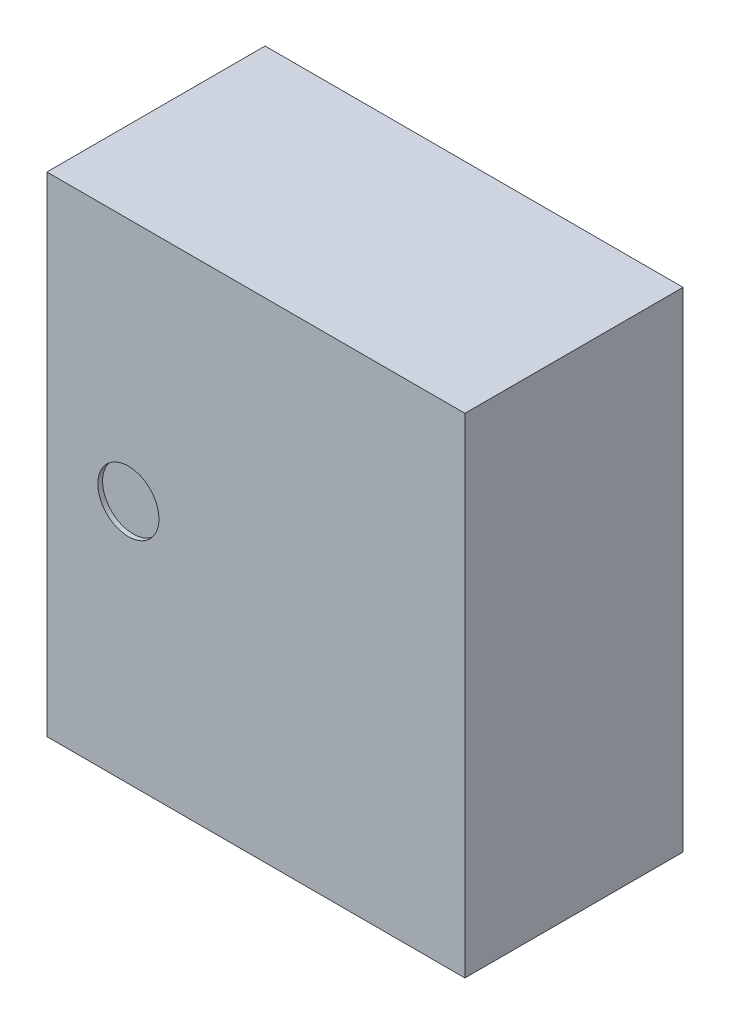
ISO-10303-21;
HEADER;
FILE_DESCRIPTION(('STEP AP214'),'2;1');
FILE_NAME('part.step','',(''),(''),'','','');
FILE_SCHEMA(('AUTOMOTIVE_DESIGN { 1 0 10303 214 1 1 1 1 }'));
ENDSEC;
DATA;
#1=APPLICATION_CONTEXT('core data for automotive mechanical design processes');
#2=APPLICATION_PROTOCOL_DEFINITION('international standard','automotive_design',2000,#1);
#3=PRODUCT_CONTEXT('',#1,'mechanical');
#4=PRODUCT('Part','Part','',(#3));
#5=PRODUCT_RELATED_PRODUCT_CATEGORY('part','',(#4));
#6=PRODUCT_DEFINITION_FORMATION('','',#4);
#7=PRODUCT_DEFINITION_CONTEXT('part definition',#1,'design');
#8=PRODUCT_DEFINITION('design','',#6,#7);
#9=PRODUCT_DEFINITION_SHAPE('','',#8);
#10=(LENGTH_UNIT() NAMED_UNIT(*) SI_UNIT(.MILLI.,.METRE.));
#11=(NAMED_UNIT(*) PLANE_ANGLE_UNIT() SI_UNIT($,.RADIAN.));
#12=(NAMED_UNIT(*) SI_UNIT($,.STERADIAN.) SOLID_ANGLE_UNIT());
#13=UNCERTAINTY_MEASURE_WITH_UNIT(LENGTH_MEASURE(1.E-05),#10,'distance_accuracy_value','');
#14=(GEOMETRIC_REPRESENTATION_CONTEXT(3) GLOBAL_UNCERTAINTY_ASSIGNED_CONTEXT((#13)) GLOBAL_UNIT_ASSIGNED_CONTEXT((#10,
#11,#12)) REPRESENTATION_CONTEXT('',''));
#15=CARTESIAN_POINT('',(0.,0.,0.));
#16=DIRECTION('',(0.,0.,1.));
#17=DIRECTION('',(1.,0.,0.));
#18=AXIS2_PLACEMENT_3D('',#15,#16,#17);
#19=CARTESIAN_POINT('',(1.733333333333,5.2,4.54));
#20=DIRECTION('',(0.,0.,1.));
#21=DIRECTION('',(1.,0.,0.));
#22=AXIS2_PLACEMENT_3D('',#19,#20,#21);
#23=PLANE('',#22);
#24=CARTESIAN_POINT('',(1.733333333333,5.2,4.54));
#25=DIRECTION('',(0.,0.,1.));
#26=DIRECTION('',(1.,0.,0.));
#27=AXIS2_PLACEMENT_3D('',#24,#25,#26);
#28=CIRCLE('',#27,0.65);
#29=CARTESIAN_POINT('',(2.383333333333,5.2,4.54));
#30=VERTEX_POINT('',#29);
#31=EDGE_CURVE('E20',#30,#30,#28,.T.);
#32=ORIENTED_EDGE('',*,*,#31,.T.);
#33=EDGE_LOOP('',(#32));
#34=FACE_BOUND('',#33,.T.);
#35=ADVANCED_FACE('F17',(#34),#23,.T.);
#36=CARTESIAN_POINT('',(1.733333333333,5.2,4.54));
#37=DIRECTION('',(0.,0.,1.));
#38=DIRECTION('',(1.,0.,0.));
#39=AXIS2_PLACEMENT_3D('',#36,#37,#38);
#40=CYLINDRICAL_SURFACE('',#39,0.65);
#41=CARTESIAN_POINT('',(1.733333333333,5.2,4.64));
#42=DIRECTION('',(0.,0.,1.));
#43=DIRECTION('',(1.,0.,0.));
#44=AXIS2_PLACEMENT_3D('',#41,#42,#43);
#45=CIRCLE('',#44,0.65);
#46=CARTESIAN_POINT('',(2.383333333333,5.2,4.64));
#47=VERTEX_POINT('',#46);
#48=EDGE_CURVE('E66',#47,#47,#45,.F.);
#49=ORIENTED_EDGE('',*,*,#48,.F.);
#50=EDGE_LOOP('',(#49));
#51=FACE_BOUND('',#50,.T.);
#52=ORIENTED_EDGE('',*,*,#31,.F.);
#53=EDGE_LOOP('',(#52));
#54=FACE_BOUND('',#53,.T.);
#55=ADVANCED_FACE('F87',(#51,#54),#40,.F.);
#56=CARTESIAN_POINT('',(0.,0.,4.64));
#57=DIRECTION('',(0.,0.,1.));
#58=DIRECTION('',(1.,0.,0.));
#59=AXIS2_PLACEMENT_3D('',#56,#57,#58);
#60=PLANE('',#59);
#61=ORIENTED_EDGE('',*,*,#48,.T.);
#62=EDGE_LOOP('',(#61));
#63=FACE_BOUND('',#62,.T.);
#64=DIRECTION('',(0.,1.,0.));
#65=VECTOR('',#64,1.);
#66=CARTESIAN_POINT('',(8.89,0.,4.64));
#67=LINE('',#66,#65);
#68=CARTESIAN_POINT('',(8.89,10.4,4.64));
#69=VERTEX_POINT('',#68);
#70=CARTESIAN_POINT('',(8.89,0.,4.64));
#71=VERTEX_POINT('',#70);
#72=EDGE_CURVE('E166',#69,#71,#67,.F.);
#73=ORIENTED_EDGE('',*,*,#72,.F.);
#74=DIRECTION('',(1.,0.,0.));
#75=VECTOR('',#74,1.);
#76=CARTESIAN_POINT('',(0.,10.4,4.64));
#77=LINE('',#76,#75);
#78=CARTESIAN_POINT('',(0.,10.4,4.64));
#79=VERTEX_POINT('',#78);
#80=EDGE_CURVE('E60',#79,#69,#77,.T.);
#81=ORIENTED_EDGE('',*,*,#80,.F.);
#82=DIRECTION('',(0.,1.,0.));
#83=VECTOR('',#82,1.);
#84=CARTESIAN_POINT('',(0.,0.,4.64));
#85=LINE('',#84,#83);
#86=CARTESIAN_POINT('',(0.,0.,4.64));
#87=VERTEX_POINT('',#86);
#88=EDGE_CURVE('E58',#79,#87,#85,.F.);
#89=ORIENTED_EDGE('',*,*,#88,.T.);
#90=DIRECTION('',(1.,0.,0.));
#91=VECTOR('',#90,1.);
#92=CARTESIAN_POINT('',(0.,0.,4.64));
#93=LINE('',#92,#91);
#94=EDGE_CURVE('E55',#87,#71,#93,.T.);
#95=ORIENTED_EDGE('',*,*,#94,.T.);
#96=EDGE_LOOP('',(#73,#81,#89,#95));
#97=FACE_BOUND('',#96,.T.);
#98=ADVANCED_FACE('F59',(#63,#97),#60,.T.);
#99=CARTESIAN_POINT('',(0.,0.,0.));
#100=DIRECTION('',(1.,0.,0.));
#101=DIRECTION('',(0.,0.,-1.));
#102=AXIS2_PLACEMENT_3D('',#99,#100,#101);
#103=PLANE('',#102);
#104=DIRECTION('',(0.,0.,1.));
#105=VECTOR('',#104,1.);
#106=CARTESIAN_POINT('',(0.,10.4,0.));
#107=LINE('',#106,#105);
#108=CARTESIAN_POINT('',(0.,10.4,0.));
#109=VERTEX_POINT('',#108);
#110=EDGE_CURVE('E170',#109,#79,#107,.T.);
#111=ORIENTED_EDGE('',*,*,#110,.F.);
#112=DIRECTION('',(0.,1.,0.));
#113=VECTOR('',#112,1.);
#114=CARTESIAN_POINT('',(0.,0.,0.));
#115=LINE('',#114,#113);
#116=CARTESIAN_POINT('',(0.,0.,0.));
#117=VERTEX_POINT('',#116);
#118=EDGE_CURVE('E77',#109,#117,#115,.F.);
#119=ORIENTED_EDGE('',*,*,#118,.T.);
#120=DIRECTION('',(0.,0.,1.));
#121=VECTOR('',#120,1.);
#122=CARTESIAN_POINT('',(0.,0.,0.));
#123=LINE('',#122,#121);
#124=EDGE_CURVE('E65',#117,#87,#123,.T.);
#125=ORIENTED_EDGE('',*,*,#124,.T.);
#126=ORIENTED_EDGE('',*,*,#88,.F.);
#127=EDGE_LOOP('',(#111,#119,#125,#126));
#128=FACE_BOUND('',#127,.T.);
#129=ADVANCED_FACE('F76',(#128),#103,.F.);
#130=CARTESIAN_POINT('',(0.,0.,0.));
#131=DIRECTION('',(0.,1.,0.));
#132=DIRECTION('',(0.,0.,1.));
#133=AXIS2_PLACEMENT_3D('',#130,#131,#132);
#134=PLANE('',#133);
#135=ORIENTED_EDGE('',*,*,#94,.F.);
#136=ORIENTED_EDGE('',*,*,#124,.F.);
#137=DIRECTION('',(1.,0.,0.));
#138=VECTOR('',#137,1.);
#139=CARTESIAN_POINT('',(0.,0.,0.));
#140=LINE('',#139,#138);
#141=CARTESIAN_POINT('',(8.89,0.,0.));
#142=VERTEX_POINT('',#141);
#143=EDGE_CURVE('E168',#117,#142,#140,.T.);
#144=ORIENTED_EDGE('',*,*,#143,.T.);
#145=DIRECTION('',(0.,0.,-1.));
#146=VECTOR('',#145,1.);
#147=CARTESIAN_POINT('',(8.89,0.,0.));
#148=LINE('',#147,#146);
#149=EDGE_CURVE('E73',#71,#142,#148,.T.);
#150=ORIENTED_EDGE('',*,*,#149,.F.);
#151=EDGE_LOOP('',(#135,#136,#144,#150));
#152=FACE_BOUND('',#151,.T.);
#153=ADVANCED_FACE('F70',(#152),#134,.F.);
#154=CARTESIAN_POINT('',(8.89,0.,0.));
#155=DIRECTION('',(1.,0.,0.));
#156=DIRECTION('',(0.,0.,-1.));
#157=AXIS2_PLACEMENT_3D('',#154,#155,#156);
#158=PLANE('',#157);
#159=DIRECTION('',(0.,0.,1.));
#160=VECTOR('',#159,1.);
#161=CARTESIAN_POINT('',(8.89,10.4,0.));
#162=LINE('',#161,#160);
#163=CARTESIAN_POINT('',(8.89,10.4,0.));
#164=VERTEX_POINT('',#163);
#165=EDGE_CURVE('E34',#69,#164,#162,.F.);
#166=ORIENTED_EDGE('',*,*,#165,.F.);
#167=ORIENTED_EDGE('',*,*,#72,.T.);
#168=ORIENTED_EDGE('',*,*,#149,.T.);
#169=DIRECTION('',(0.,1.,0.));
#170=VECTOR('',#169,1.);
#171=CARTESIAN_POINT('',(8.89,0.,0.));
#172=LINE('',#171,#170);
#173=EDGE_CURVE('E26',#142,#164,#172,.T.);
#174=ORIENTED_EDGE('',*,*,#173,.T.);
#175=EDGE_LOOP('',(#166,#167,#168,#174));
#176=FACE_BOUND('',#175,.T.);
#177=ADVANCED_FACE('F104',(#176),#158,.T.);
#178=CARTESIAN_POINT('',(0.,10.4,0.));
#179=DIRECTION('',(0.,1.,0.));
#180=DIRECTION('',(0.,0.,1.));
#181=AXIS2_PLACEMENT_3D('',#178,#179,#180);
#182=PLANE('',#181);
#183=ORIENTED_EDGE('',*,*,#80,.T.);
#184=ORIENTED_EDGE('',*,*,#165,.T.);
#185=DIRECTION('',(1.,0.,0.));
#186=VECTOR('',#185,1.);
#187=CARTESIAN_POINT('',(0.,10.4,0.));
#188=LINE('',#187,#186);
#189=EDGE_CURVE('E11',#164,#109,#188,.F.);
#190=ORIENTED_EDGE('',*,*,#189,.T.);
#191=ORIENTED_EDGE('',*,*,#110,.T.);
#192=EDGE_LOOP('',(#183,#184,#190,#191));
#193=FACE_BOUND('',#192,.T.);
#194=ADVANCED_FACE('F98',(#193),#182,.T.);
#195=CARTESIAN_POINT('',(0.,0.,0.));
#196=DIRECTION('',(0.,0.,1.));
#197=DIRECTION('',(1.,0.,0.));
#198=AXIS2_PLACEMENT_3D('',#195,#196,#197);
#199=PLANE('',#198);
#200=ORIENTED_EDGE('',*,*,#173,.F.);
#201=ORIENTED_EDGE('',*,*,#143,.F.);
#202=ORIENTED_EDGE('',*,*,#118,.F.);
#203=ORIENTED_EDGE('',*,*,#189,.F.);
#204=EDGE_LOOP('',(#200,#201,#202,#203));
#205=FACE_BOUND('',#204,.T.);
#206=ADVANCED_FACE('F96',(#205),#199,.F.);
#207=CLOSED_SHELL('',(#35,#55,#98,#129,#153,#177,#194,#206));
#208=MANIFOLD_SOLID_BREP('B1',#207);
#209=ADVANCED_BREP_SHAPE_REPRESENTATION('',(#18,#208),#14);
#210=SHAPE_DEFINITION_REPRESENTATION(#9,#209);
ENDSEC;
END-ISO-10303-21;
